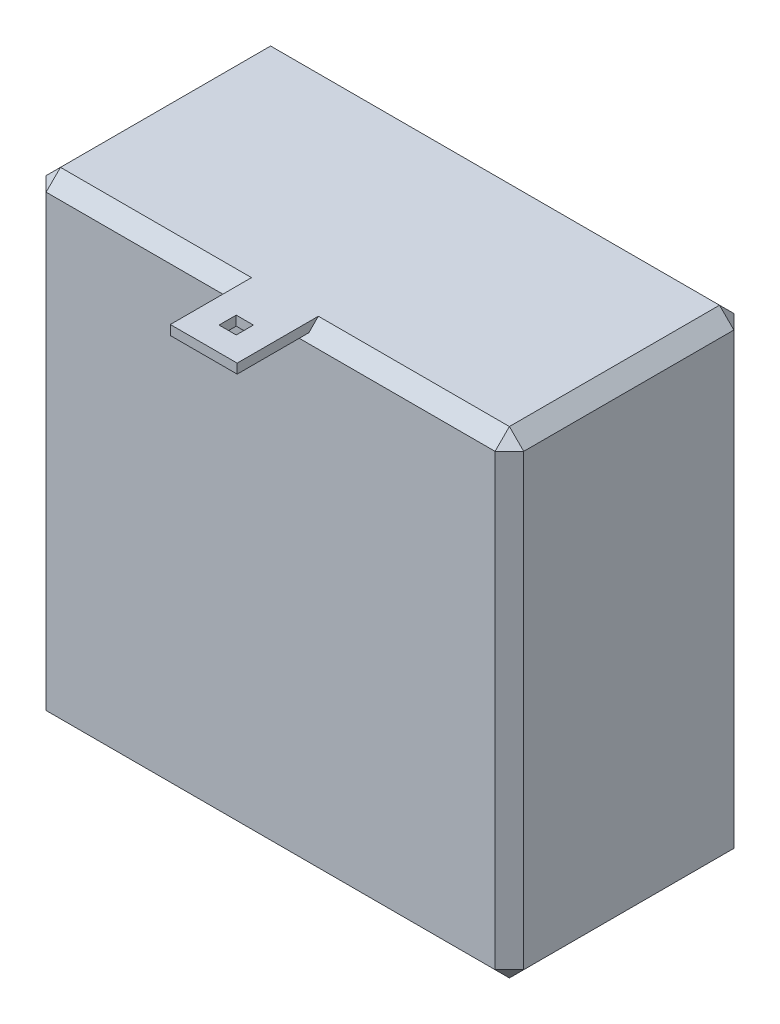
ISO-10303-21;
HEADER;
FILE_DESCRIPTION(('STEP AP214'),'2;1');
FILE_NAME('part.step','',(''),(''),'','','');
FILE_SCHEMA(('AUTOMOTIVE_DESIGN { 1 0 10303 214 1 1 1 1 }'));
ENDSEC;
DATA;
#1=APPLICATION_CONTEXT('core data for automotive mechanical design processes');
#2=APPLICATION_PROTOCOL_DEFINITION('international standard','automotive_design',2000,#1);
#3=PRODUCT_CONTEXT('',#1,'mechanical');
#4=PRODUCT('Part','Part','',(#3));
#5=PRODUCT_RELATED_PRODUCT_CATEGORY('part','',(#4));
#6=PRODUCT_DEFINITION_FORMATION('','',#4);
#7=PRODUCT_DEFINITION_CONTEXT('part definition',#1,'design');
#8=PRODUCT_DEFINITION('design','',#6,#7);
#9=PRODUCT_DEFINITION_SHAPE('','',#8);
#10=(LENGTH_UNIT() NAMED_UNIT(*) SI_UNIT(.MILLI.,.METRE.));
#11=(NAMED_UNIT(*) PLANE_ANGLE_UNIT() SI_UNIT($,.RADIAN.));
#12=(NAMED_UNIT(*) SI_UNIT($,.STERADIAN.) SOLID_ANGLE_UNIT());
#13=UNCERTAINTY_MEASURE_WITH_UNIT(LENGTH_MEASURE(1.E-05),#10,'distance_accuracy_value','');
#14=(GEOMETRIC_REPRESENTATION_CONTEXT(3) GLOBAL_UNCERTAINTY_ASSIGNED_CONTEXT((#13)) GLOBAL_UNIT_ASSIGNED_CONTEXT((#10,
#11,#12)) REPRESENTATION_CONTEXT('',''));
#15=CARTESIAN_POINT('',(0.,0.,0.));
#16=DIRECTION('',(0.,0.,1.));
#17=DIRECTION('',(1.,0.,0.));
#18=AXIS2_PLACEMENT_3D('',#15,#16,#17);
#19=CARTESIAN_POINT('',(0.,0.,25.));
#20=DIRECTION('',(1.,0.,0.));
#21=DIRECTION('',(0.,0.,-1.));
#22=AXIS2_PLACEMENT_3D('',#19,#20,#21);
#23=PLANE('',#22);
#24=DIRECTION('',(0.,0.,-1.));
#25=VECTOR('',#24,1.);
#26=CARTESIAN_POINT('',(0.,48.5,25.));
#27=LINE('',#26,#25);
#28=CARTESIAN_POINT('',(0.,48.5,23.5));
#29=VERTEX_POINT('',#28);
#30=CARTESIAN_POINT('',(0.,48.5,1.49999999999999));
#31=VERTEX_POINT('',#30);
#32=EDGE_CURVE('E233',#29,#31,#27,.T.);
#33=ORIENTED_EDGE('',*,*,#32,.T.);
#34=DIRECTION('',(0.,-1.,0.));
#35=VECTOR('',#34,1.);
#36=CARTESIAN_POINT('',(0.,0.,1.49999999999999));
#37=LINE('',#36,#35);
#38=CARTESIAN_POINT('',(0.,1.49999999999999,1.49999999999999));
#39=VERTEX_POINT('',#38);
#40=EDGE_CURVE('E235',#31,#39,#37,.T.);
#41=ORIENTED_EDGE('',*,*,#40,.T.);
#42=DIRECTION('',(0.,0.,1.));
#43=VECTOR('',#42,1.);
#44=CARTESIAN_POINT('',(0.,1.49999999999999,25.));
#45=LINE('',#44,#43);
#46=CARTESIAN_POINT('',(0.,1.49999999999999,23.5));
#47=VERTEX_POINT('',#46);
#48=EDGE_CURVE('E230',#39,#47,#45,.T.);
#49=ORIENTED_EDGE('',*,*,#48,.T.);
#50=DIRECTION('',(0.,1.,0.));
#51=VECTOR('',#50,1.);
#52=CARTESIAN_POINT('',(0.,0.,23.5));
#53=LINE('',#52,#51);
#54=EDGE_CURVE('E228',#47,#29,#53,.T.);
#55=ORIENTED_EDGE('',*,*,#54,.T.);
#56=EDGE_LOOP('',(#33,#41,#49,#55));
#57=FACE_BOUND('',#56,.T.);
#58=ADVANCED_FACE('F33',(#57),#23,.F.);
#59=CARTESIAN_POINT('',(0.,0.,25.));
#60=DIRECTION('',(0.,1.,0.));
#61=DIRECTION('',(0.,0.,1.));
#62=AXIS2_PLACEMENT_3D('',#59,#60,#61);
#63=PLANE('',#62);
#64=DIRECTION('',(-1.,0.,0.));
#65=VECTOR('',#64,1.);
#66=CARTESIAN_POINT('',(0.,0.,23.5));
#67=LINE('',#66,#65);
#68=CARTESIAN_POINT('',(48.5,0.,23.5));
#69=VERTEX_POINT('',#68);
#70=CARTESIAN_POINT('',(1.49999999999999,0.,23.5));
#71=VERTEX_POINT('',#70);
#72=EDGE_CURVE('E267',#69,#71,#67,.T.);
#73=ORIENTED_EDGE('',*,*,#72,.T.);
#74=DIRECTION('',(0.,0.,-1.));
#75=VECTOR('',#74,1.);
#76=CARTESIAN_POINT('',(1.49999999999999,0.,25.));
#77=LINE('',#76,#75);
#78=CARTESIAN_POINT('',(1.49999999999999,0.,1.49999999999999));
#79=VERTEX_POINT('',#78);
#80=EDGE_CURVE('E273',#71,#79,#77,.T.);
#81=ORIENTED_EDGE('',*,*,#80,.T.);
#82=DIRECTION('',(1.,0.,0.));
#83=VECTOR('',#82,1.);
#84=CARTESIAN_POINT('',(50.,0.,1.49999999999999));
#85=LINE('',#84,#83);
#86=CARTESIAN_POINT('',(48.5,0.,1.49999999999999));
#87=VERTEX_POINT('',#86);
#88=EDGE_CURVE('E271',#79,#87,#85,.T.);
#89=ORIENTED_EDGE('',*,*,#88,.T.);
#90=DIRECTION('',(0.,0.,1.));
#91=VECTOR('',#90,1.);
#92=CARTESIAN_POINT('',(48.5,0.,25.));
#93=LINE('',#92,#91);
#94=EDGE_CURVE('E269',#87,#69,#93,.T.);
#95=ORIENTED_EDGE('',*,*,#94,.T.);
#96=EDGE_LOOP('',(#73,#81,#89,#95));
#97=FACE_BOUND('',#96,.T.);
#98=ADVANCED_FACE('F459',(#97),#63,.F.);
#99=CARTESIAN_POINT('',(50.,0.,25.));
#100=DIRECTION('',(-1.,0.,0.));
#101=DIRECTION('',(0.,0.,1.));
#102=AXIS2_PLACEMENT_3D('',#99,#100,#101);
#103=PLANE('',#102);
#104=DIRECTION('',(0.,1.,0.));
#105=VECTOR('',#104,1.);
#106=CARTESIAN_POINT('',(50.,50.,1.49999999999999));
#107=LINE('',#106,#105);
#108=CARTESIAN_POINT('',(50.,1.49999999999999,1.49999999999999));
#109=VERTEX_POINT('',#108);
#110=CARTESIAN_POINT('',(50.,48.5,1.49999999999999));
#111=VERTEX_POINT('',#110);
#112=EDGE_CURVE('E262',#109,#111,#107,.T.);
#113=ORIENTED_EDGE('',*,*,#112,.T.);
#114=DIRECTION('',(0.,0.,1.));
#115=VECTOR('',#114,1.);
#116=CARTESIAN_POINT('',(50.,48.5,25.));
#117=LINE('',#116,#115);
#118=CARTESIAN_POINT('',(50.,48.5,23.5));
#119=VERTEX_POINT('',#118);
#120=EDGE_CURVE('E264',#111,#119,#117,.T.);
#121=ORIENTED_EDGE('',*,*,#120,.T.);
#122=DIRECTION('',(0.,-1.,0.));
#123=VECTOR('',#122,1.);
#124=CARTESIAN_POINT('',(50.,0.,23.5));
#125=LINE('',#124,#123);
#126=CARTESIAN_POINT('',(50.,1.49999999999999,23.5));
#127=VERTEX_POINT('',#126);
#128=EDGE_CURVE('E258',#119,#127,#125,.T.);
#129=ORIENTED_EDGE('',*,*,#128,.T.);
#130=DIRECTION('',(0.,0.,-1.));
#131=VECTOR('',#130,1.);
#132=CARTESIAN_POINT('',(50.,1.49999999999999,25.));
#133=LINE('',#132,#131);
#134=EDGE_CURVE('E260',#127,#109,#133,.T.);
#135=ORIENTED_EDGE('',*,*,#134,.T.);
#136=EDGE_LOOP('',(#113,#121,#129,#135));
#137=FACE_BOUND('',#136,.T.);
#138=ADVANCED_FACE('F457',(#137),#103,.F.);
#139=CARTESIAN_POINT('',(0.,50.,25.));
#140=DIRECTION('',(0.,-1.,0.));
#141=DIRECTION('',(0.,0.,-1.));
#142=AXIS2_PLACEMENT_3D('',#139,#140,#141);
#143=PLANE('',#142);
#144=DIRECTION('',(-1.,0.,0.));
#145=VECTOR('',#144,1.);
#146=CARTESIAN_POINT('',(0.,50.,29.5));
#147=LINE('',#146,#145);
#148=CARTESIAN_POINT('',(25.9,50.,29.5));
#149=VERTEX_POINT('',#148);
#150=CARTESIAN_POINT('',(24.1,50.,29.5));
#151=VERTEX_POINT('',#150);
#152=EDGE_CURVE('E201',#149,#151,#147,.T.);
#153=ORIENTED_EDGE('',*,*,#152,.T.);
#154=DIRECTION('',(0.,0.,-1.));
#155=VECTOR('',#154,1.);
#156=CARTESIAN_POINT('',(24.1,50.,25.));
#157=LINE('',#156,#155);
#158=CARTESIAN_POINT('',(24.1,50.,27.7));
#159=VERTEX_POINT('',#158);
#160=EDGE_CURVE('E204',#151,#159,#157,.T.);
#161=ORIENTED_EDGE('',*,*,#160,.T.);
#162=DIRECTION('',(1.,0.,0.));
#163=VECTOR('',#162,1.);
#164=CARTESIAN_POINT('',(0.,50.,27.7));
#165=LINE('',#164,#163);
#166=CARTESIAN_POINT('',(25.9,50.,27.7));
#167=VERTEX_POINT('',#166);
#168=EDGE_CURVE('E196',#159,#167,#165,.T.);
#169=ORIENTED_EDGE('',*,*,#168,.T.);
#170=DIRECTION('',(0.,0.,1.));
#171=VECTOR('',#170,1.);
#172=CARTESIAN_POINT('',(25.9,50.,25.));
#173=LINE('',#172,#171);
#174=EDGE_CURVE('E176',#167,#149,#173,.T.);
#175=ORIENTED_EDGE('',*,*,#174,.T.);
#176=EDGE_LOOP('',(#153,#161,#169,#175));
#177=FACE_BOUND('',#176,.T.);
#178=DIRECTION('',(0.,0.,1.));
#179=VECTOR('',#178,1.);
#180=CARTESIAN_POINT('',(28.5,50.,15.));
#181=LINE('',#180,#179);
#182=CARTESIAN_POINT('',(28.5,50.,23.5));
#183=VERTEX_POINT('',#182);
#184=CARTESIAN_POINT('',(28.5,50.,32.));
#185=VERTEX_POINT('',#184);
#186=EDGE_CURVE('E223',#183,#185,#181,.T.);
#187=ORIENTED_EDGE('',*,*,#186,.F.);
#188=DIRECTION('',(1.,0.,0.));
#189=VECTOR('',#188,1.);
#190=CARTESIAN_POINT('',(0.,50.,23.5));
#191=LINE('',#190,#189);
#192=CARTESIAN_POINT('',(48.5,50.,23.5));
#193=VERTEX_POINT('',#192);
#194=EDGE_CURVE('E247',#183,#193,#191,.T.);
#195=ORIENTED_EDGE('',*,*,#194,.T.);
#196=DIRECTION('',(0.,0.,-1.));
#197=VECTOR('',#196,1.);
#198=CARTESIAN_POINT('',(48.5,50.,25.));
#199=LINE('',#198,#197);
#200=CARTESIAN_POINT('',(48.5,50.,1.49999999999999));
#201=VERTEX_POINT('',#200);
#202=EDGE_CURVE('E251',#193,#201,#199,.T.);
#203=ORIENTED_EDGE('',*,*,#202,.T.);
#204=DIRECTION('',(-1.,0.,0.));
#205=VECTOR('',#204,1.);
#206=CARTESIAN_POINT('',(0.,50.,1.49999999999999));
#207=LINE('',#206,#205);
#208=CARTESIAN_POINT('',(1.49999999999999,50.,1.49999999999999));
#209=VERTEX_POINT('',#208);
#210=EDGE_CURVE('E253',#201,#209,#207,.T.);
#211=ORIENTED_EDGE('',*,*,#210,.T.);
#212=DIRECTION('',(0.,0.,1.));
#213=VECTOR('',#212,1.);
#214=CARTESIAN_POINT('',(1.49999999999999,50.,25.));
#215=LINE('',#214,#213);
#216=CARTESIAN_POINT('',(1.49999999999999,50.,23.5));
#217=VERTEX_POINT('',#216);
#218=EDGE_CURVE('E255',#209,#217,#215,.T.);
#219=ORIENTED_EDGE('',*,*,#218,.T.);
#220=CARTESIAN_POINT('',(21.5,50.,23.5));
#221=VERTEX_POINT('',#220);
#222=EDGE_CURVE('E248',#217,#221,#191,.T.);
#223=ORIENTED_EDGE('',*,*,#222,.T.);
#224=DIRECTION('',(0.,0.,1.));
#225=VECTOR('',#224,1.);
#226=CARTESIAN_POINT('',(21.5,50.,15.));
#227=LINE('',#226,#225);
#228=CARTESIAN_POINT('',(21.5,50.,32.));
#229=VERTEX_POINT('',#228);
#230=EDGE_CURVE('E220',#221,#229,#227,.T.);
#231=ORIENTED_EDGE('',*,*,#230,.T.);
#232=DIRECTION('',(-1.,0.,0.));
#233=VECTOR('',#232,1.);
#234=CARTESIAN_POINT('',(21.5,50.,32.));
#235=LINE('',#234,#233);
#236=EDGE_CURVE('E216',#185,#229,#235,.T.);
#237=ORIENTED_EDGE('',*,*,#236,.F.);
#238=EDGE_LOOP('',(#187,#195,#203,#211,#219,#223,#231,#237));
#239=FACE_BOUND('',#238,.T.);
#240=ADVANCED_FACE('F360',(#177,#239),#143,.F.);
#241=CARTESIAN_POINT('',(0.,0.,25.));
#242=DIRECTION('',(0.,0.,-1.));
#243=DIRECTION('',(-1.,0.,0.));
#244=AXIS2_PLACEMENT_3D('',#241,#242,#243);
#245=PLANE('',#244);
#246=DIRECTION('',(0.,1.,0.));
#247=VECTOR('',#246,1.);
#248=CARTESIAN_POINT('',(48.5,0.,25.));
#249=LINE('',#248,#247);
#250=CARTESIAN_POINT('',(48.5,1.49999999999999,25.));
#251=VERTEX_POINT('',#250);
#252=CARTESIAN_POINT('',(48.5,48.5,25.));
#253=VERTEX_POINT('',#252);
#254=EDGE_CURVE('E280',#251,#253,#249,.T.);
#255=ORIENTED_EDGE('',*,*,#254,.T.);
#256=DIRECTION('',(-1.,0.,0.));
#257=VECTOR('',#256,1.);
#258=CARTESIAN_POINT('',(0.,48.5,25.));
#259=LINE('',#258,#257);
#260=CARTESIAN_POINT('',(1.49999999999999,48.5,25.));
#261=VERTEX_POINT('',#260);
#262=EDGE_CURVE('E282',#253,#261,#259,.T.);
#263=ORIENTED_EDGE('',*,*,#262,.T.);
#264=DIRECTION('',(0.,-1.,0.));
#265=VECTOR('',#264,1.);
#266=CARTESIAN_POINT('',(1.49999999999999,0.,25.));
#267=LINE('',#266,#265);
#268=CARTESIAN_POINT('',(1.49999999999999,1.49999999999999,25.));
#269=VERTEX_POINT('',#268);
#270=EDGE_CURVE('E276',#261,#269,#267,.T.);
#271=ORIENTED_EDGE('',*,*,#270,.T.);
#272=DIRECTION('',(1.,0.,0.));
#273=VECTOR('',#272,1.);
#274=CARTESIAN_POINT('',(0.,1.49999999999999,25.));
#275=LINE('',#274,#273);
#276=EDGE_CURVE('E278',#269,#251,#275,.T.);
#277=ORIENTED_EDGE('',*,*,#276,.T.);
#278=EDGE_LOOP('',(#255,#263,#271,#277));
#279=FACE_BOUND('',#278,.T.);
#280=ADVANCED_FACE('F405',(#279),#245,.F.);
#281=CARTESIAN_POINT('',(0.,0.,0.));
#282=DIRECTION('',(0.,0.,-1.));
#283=DIRECTION('',(-1.,0.,0.));
#284=AXIS2_PLACEMENT_3D('',#281,#282,#283);
#285=PLANE('',#284);
#286=DIRECTION('',(-1.,0.,0.));
#287=VECTOR('',#286,1.);
#288=CARTESIAN_POINT('',(0.,1.49999999999999,0.));
#289=LINE('',#288,#287);
#290=CARTESIAN_POINT('',(48.5,1.49999999999999,0.));
#291=VERTEX_POINT('',#290);
#292=CARTESIAN_POINT('',(1.49999999999999,1.49999999999999,0.));
#293=VERTEX_POINT('',#292);
#294=EDGE_CURVE('E238',#291,#293,#289,.T.);
#295=ORIENTED_EDGE('',*,*,#294,.T.);
#296=DIRECTION('',(0.,1.,0.));
#297=VECTOR('',#296,1.);
#298=CARTESIAN_POINT('',(1.49999999999999,50.,0.));
#299=LINE('',#298,#297);
#300=CARTESIAN_POINT('',(1.49999999999999,48.5,0.));
#301=VERTEX_POINT('',#300);
#302=EDGE_CURVE('E244',#293,#301,#299,.T.);
#303=ORIENTED_EDGE('',*,*,#302,.T.);
#304=DIRECTION('',(1.,0.,0.));
#305=VECTOR('',#304,1.);
#306=CARTESIAN_POINT('',(50.,48.5,0.));
#307=LINE('',#306,#305);
#308=CARTESIAN_POINT('',(48.5,48.5,0.));
#309=VERTEX_POINT('',#308);
#310=EDGE_CURVE('E242',#301,#309,#307,.T.);
#311=ORIENTED_EDGE('',*,*,#310,.T.);
#312=DIRECTION('',(0.,-1.,0.));
#313=VECTOR('',#312,1.);
#314=CARTESIAN_POINT('',(48.5,0.,0.));
#315=LINE('',#314,#313);
#316=EDGE_CURVE('E240',#309,#291,#315,.T.);
#317=ORIENTED_EDGE('',*,*,#316,.T.);
#318=EDGE_LOOP('',(#295,#303,#311,#317));
#319=FACE_BOUND('',#318,.T.);
#320=ADVANCED_FACE('F431',(#319),#285,.T.);
#321=CARTESIAN_POINT('',(48.5,0.,25.));
#322=DIRECTION('',(-0.707106781186549,0.,-0.707106781186546));
#323=DIRECTION('',(0.,1.,0.));
#324=AXIS2_PLACEMENT_3D('',#321,#322,#323);
#325=PLANE('',#324);
#326=DIRECTION('',(-0.707106781186546,0.,0.707106781186549));
#327=VECTOR('',#326,1.);
#328=CARTESIAN_POINT('',(50.,48.5,23.5));
#329=LINE('',#328,#327);
#330=EDGE_CURVE('E231',#253,#119,#329,.F.);
#331=ORIENTED_EDGE('',*,*,#330,.F.);
#332=ORIENTED_EDGE('',*,*,#254,.F.);
#333=DIRECTION('',(0.707106781186546,0.,-0.707106781186549));
#334=VECTOR('',#333,1.);
#335=CARTESIAN_POINT('',(49.25,1.49999999999999,24.25));
#336=LINE('',#335,#334);
#337=EDGE_CURVE('E345',#127,#251,#336,.F.);
#338=ORIENTED_EDGE('',*,*,#337,.F.);
#339=ORIENTED_EDGE('',*,*,#128,.F.);
#340=EDGE_LOOP('',(#331,#332,#338,#339));
#341=FACE_BOUND('',#340,.T.);
#342=ADVANCED_FACE('F35',(#341),#325,.F.);
#343=CARTESIAN_POINT('',(50.,48.5,23.5));
#344=DIRECTION('',(0.577350269189628,0.577350269189626,0.577350269189623));
#345=DIRECTION('',(-0.707106781186546,0.707106781186549,0.));
#346=AXIS2_PLACEMENT_3D('',#343,#344,#345);
#347=PLANE('',#346);
#348=DIRECTION('',(0.,0.707106781186546,-0.707106781186549));
#349=VECTOR('',#348,1.);
#350=CARTESIAN_POINT('',(48.5,49.25,24.25));
#351=LINE('',#350,#349);
#352=EDGE_CURVE('E340',#253,#193,#351,.T.);
#353=ORIENTED_EDGE('',*,*,#352,.F.);
#354=ORIENTED_EDGE('',*,*,#330,.T.);
#355=DIRECTION('',(0.707106781186546,-0.707106781186549,0.));
#356=VECTOR('',#355,1.);
#357=CARTESIAN_POINT('',(50.,48.5,23.5));
#358=LINE('',#357,#356);
#359=EDGE_CURVE('E343',#193,#119,#358,.T.);
#360=ORIENTED_EDGE('',*,*,#359,.F.);
#361=EDGE_LOOP('',(#353,#354,#360));
#362=FACE_BOUND('',#361,.T.);
#363=ADVANCED_FACE('F413',(#362),#347,.T.);
#364=CARTESIAN_POINT('',(48.5,0.,23.5));
#365=DIRECTION('',(0.577350269189626,-0.577350269189628,0.577350269189623));
#366=DIRECTION('',(0.707106781186549,0.707106781186546,0.));
#367=AXIS2_PLACEMENT_3D('',#364,#365,#366);
#368=PLANE('',#367);
#369=DIRECTION('',(-0.707106781186549,-0.707106781186546,0.));
#370=VECTOR('',#369,1.);
#371=CARTESIAN_POINT('',(48.5,0.,23.5));
#372=LINE('',#371,#370);
#373=EDGE_CURVE('E334',#127,#69,#372,.T.);
#374=ORIENTED_EDGE('',*,*,#373,.F.);
#375=ORIENTED_EDGE('',*,*,#337,.T.);
#376=DIRECTION('',(0.,0.707106781186546,0.707106781186549));
#377=VECTOR('',#376,1.);
#378=CARTESIAN_POINT('',(48.5,0.,23.5));
#379=LINE('',#378,#377);
#380=EDGE_CURVE('E337',#69,#251,#379,.T.);
#381=ORIENTED_EDGE('',*,*,#380,.F.);
#382=EDGE_LOOP('',(#374,#375,#381));
#383=FACE_BOUND('',#382,.T.);
#384=ADVANCED_FACE('F451',(#383),#368,.T.);
#385=CARTESIAN_POINT('',(48.5,50.,25.));
#386=DIRECTION('',(-0.707106781186549,-0.707106781186546,0.));
#387=DIRECTION('',(0.,0.,-1.));
#388=AXIS2_PLACEMENT_3D('',#385,#386,#387);
#389=PLANE('',#388);
#390=ORIENTED_EDGE('',*,*,#359,.T.);
#391=ORIENTED_EDGE('',*,*,#120,.F.);
#392=DIRECTION('',(-0.707106781186546,0.707106781186549,0.));
#393=VECTOR('',#392,1.);
#394=CARTESIAN_POINT('',(49.25,49.25,1.49999999999999));
#395=LINE('',#394,#393);
#396=EDGE_CURVE('E328',#201,#111,#395,.F.);
#397=ORIENTED_EDGE('',*,*,#396,.F.);
#398=ORIENTED_EDGE('',*,*,#202,.F.);
#399=EDGE_LOOP('',(#390,#391,#397,#398));
#400=FACE_BOUND('',#399,.T.);
#401=ADVANCED_FACE('F418',(#400),#389,.F.);
#402=CARTESIAN_POINT('',(0.,48.5,25.));
#403=DIRECTION('',(0.,-0.707106781186549,-0.707106781186546));
#404=DIRECTION('',(-1.,0.,0.));
#405=AXIS2_PLACEMENT_3D('',#402,#403,#404);
#406=PLANE('',#405);
#407=DIRECTION('',(0.,0.707106781186546,-0.707106781186549));
#408=VECTOR('',#407,1.);
#409=CARTESIAN_POINT('',(21.5,48.5,25.));
#410=LINE('',#409,#408);
#411=CARTESIAN_POINT('',(21.5,49.,24.5));
#412=VERTEX_POINT('',#411);
#413=EDGE_CURVE('E11',#221,#412,#410,.F.);
#414=ORIENTED_EDGE('',*,*,#413,.F.);
#415=ORIENTED_EDGE('',*,*,#222,.F.);
#416=DIRECTION('',(0.,-0.707106781186546,0.707106781186549));
#417=VECTOR('',#416,1.);
#418=CARTESIAN_POINT('',(1.49999999999999,50.,23.5));
#419=LINE('',#418,#417);
#420=EDGE_CURVE('E325',#261,#217,#419,.F.);
#421=ORIENTED_EDGE('',*,*,#420,.F.);
#422=ORIENTED_EDGE('',*,*,#262,.F.);
#423=ORIENTED_EDGE('',*,*,#352,.T.);
#424=ORIENTED_EDGE('',*,*,#194,.F.);
#425=DIRECTION('',(0.,-0.707106781186546,0.707106781186549));
#426=VECTOR('',#425,1.);
#427=CARTESIAN_POINT('',(28.5,48.5,25.));
#428=LINE('',#427,#426);
#429=CARTESIAN_POINT('',(28.5,49.,24.5));
#430=VERTEX_POINT('',#429);
#431=EDGE_CURVE('E41',#430,#183,#428,.F.);
#432=ORIENTED_EDGE('',*,*,#431,.F.);
#433=DIRECTION('',(-1.,0.,0.));
#434=VECTOR('',#433,1.);
#435=CARTESIAN_POINT('',(0.,49.,24.5));
#436=LINE('',#435,#434);
#437=EDGE_CURVE('E285',#412,#430,#436,.F.);
#438=ORIENTED_EDGE('',*,*,#437,.F.);
#439=EDGE_LOOP('',(#414,#415,#421,#422,#423,#424,#432,#438));
#440=FACE_BOUND('',#439,.T.);
#441=ADVANCED_FACE('F369',(#440),#406,.F.);
#442=CARTESIAN_POINT('',(1.49999999999999,0.,25.));
#443=DIRECTION('',(0.707106781186549,0.,-0.707106781186546));
#444=DIRECTION('',(0.,-1.,0.));
#445=AXIS2_PLACEMENT_3D('',#442,#443,#444);
#446=PLANE('',#445);
#447=DIRECTION('',(0.707106781186546,0.,0.707106781186549));
#448=VECTOR('',#447,1.);
#449=CARTESIAN_POINT('',(0.,1.49999999999999,23.5));
#450=LINE('',#449,#448);
#451=EDGE_CURVE('E320',#269,#47,#450,.F.);
#452=ORIENTED_EDGE('',*,*,#451,.F.);
#453=ORIENTED_EDGE('',*,*,#270,.F.);
#454=DIRECTION('',(-0.707106781186546,0.,-0.707106781186549));
#455=VECTOR('',#454,1.);
#456=CARTESIAN_POINT('',(0.749999999999994,48.5,24.25));
#457=LINE('',#456,#455);
#458=EDGE_CURVE('E323',#29,#261,#457,.F.);
#459=ORIENTED_EDGE('',*,*,#458,.F.);
#460=ORIENTED_EDGE('',*,*,#54,.F.);
#461=EDGE_LOOP('',(#452,#453,#459,#460));
#462=FACE_BOUND('',#461,.T.);
#463=ADVANCED_FACE('F398',(#462),#446,.F.);
#464=CARTESIAN_POINT('',(0.,1.49999999999999,25.));
#465=DIRECTION('',(0.,0.707106781186549,-0.707106781186546));
#466=DIRECTION('',(1.,0.,0.));
#467=AXIS2_PLACEMENT_3D('',#464,#465,#466);
#468=PLANE('',#467);
#469=ORIENTED_EDGE('',*,*,#380,.T.);
#470=ORIENTED_EDGE('',*,*,#276,.F.);
#471=DIRECTION('',(0.,-0.707106781186546,-0.707106781186549));
#472=VECTOR('',#471,1.);
#473=CARTESIAN_POINT('',(1.49999999999999,0.749999999999994,24.25));
#474=LINE('',#473,#472);
#475=EDGE_CURVE('E317',#71,#269,#474,.F.);
#476=ORIENTED_EDGE('',*,*,#475,.F.);
#477=ORIENTED_EDGE('',*,*,#72,.F.);
#478=EDGE_LOOP('',(#469,#470,#476,#477));
#479=FACE_BOUND('',#478,.T.);
#480=ADVANCED_FACE('F447',(#479),#468,.F.);
#481=CARTESIAN_POINT('',(50.,1.49999999999999,25.));
#482=DIRECTION('',(-0.707106781186546,0.707106781186549,0.));
#483=DIRECTION('',(0.,0.,-1.));
#484=AXIS2_PLACEMENT_3D('',#481,#482,#483);
#485=PLANE('',#484);
#486=ORIENTED_EDGE('',*,*,#373,.T.);
#487=ORIENTED_EDGE('',*,*,#94,.F.);
#488=DIRECTION('',(0.707106781186549,0.707106781186546,0.));
#489=VECTOR('',#488,1.);
#490=CARTESIAN_POINT('',(49.25,0.749999999999994,1.49999999999999));
#491=LINE('',#490,#489);
#492=EDGE_CURVE('E314',#109,#87,#491,.F.);
#493=ORIENTED_EDGE('',*,*,#492,.F.);
#494=ORIENTED_EDGE('',*,*,#134,.F.);
#495=EDGE_LOOP('',(#486,#487,#493,#494));
#496=FACE_BOUND('',#495,.T.);
#497=ADVANCED_FACE('F455',(#496),#485,.F.);
#498=CARTESIAN_POINT('',(50.,0.,1.49999999999999));
#499=DIRECTION('',(0.707106781186546,0.,-0.707106781186549));
#500=DIRECTION('',(0.,-1.,0.));
#501=AXIS2_PLACEMENT_3D('',#498,#499,#500);
#502=PLANE('',#501);
#503=DIRECTION('',(-0.707106781186549,0.,-0.707106781186546));
#504=VECTOR('',#503,1.);
#505=CARTESIAN_POINT('',(48.5,48.5,0.));
#506=LINE('',#505,#504);
#507=EDGE_CURVE('E331',#111,#309,#506,.T.);
#508=ORIENTED_EDGE('',*,*,#507,.F.);
#509=ORIENTED_EDGE('',*,*,#112,.F.);
#510=DIRECTION('',(0.707106781186549,0.,0.707106781186546));
#511=VECTOR('',#510,1.);
#512=CARTESIAN_POINT('',(48.5,1.49999999999999,0.));
#513=LINE('',#512,#511);
#514=EDGE_CURVE('E311',#291,#109,#513,.T.);
#515=ORIENTED_EDGE('',*,*,#514,.F.);
#516=ORIENTED_EDGE('',*,*,#316,.F.);
#517=EDGE_LOOP('',(#508,#509,#515,#516));
#518=FACE_BOUND('',#517,.T.);
#519=ADVANCED_FACE('F426',(#518),#502,.T.);
#520=CARTESIAN_POINT('',(48.5,48.5,0.));
#521=DIRECTION('',(0.577350269189626,0.577350269189623,-0.577350269189628));
#522=DIRECTION('',(-0.707106781186549,0.,-0.707106781186546));
#523=AXIS2_PLACEMENT_3D('',#520,#521,#522);
#524=PLANE('',#523);
#525=ORIENTED_EDGE('',*,*,#396,.T.);
#526=ORIENTED_EDGE('',*,*,#507,.T.);
#527=DIRECTION('',(0.,0.707106781186549,0.707106781186546));
#528=VECTOR('',#527,1.);
#529=CARTESIAN_POINT('',(48.5,48.5,0.));
#530=LINE('',#529,#528);
#531=EDGE_CURVE('E308',#201,#309,#530,.F.);
#532=ORIENTED_EDGE('',*,*,#531,.F.);
#533=EDGE_LOOP('',(#525,#526,#532));
#534=FACE_BOUND('',#533,.T.);
#535=ADVANCED_FACE('F422',(#534),#524,.T.);
#536=CARTESIAN_POINT('',(1.49999999999999,50.,23.5));
#537=DIRECTION('',(-0.577350269189628,0.577350269189626,0.577350269189623));
#538=DIRECTION('',(-0.707106781186546,-0.707106781186549,0.));
#539=AXIS2_PLACEMENT_3D('',#536,#537,#538);
#540=PLANE('',#539);
#541=ORIENTED_EDGE('',*,*,#458,.T.);
#542=ORIENTED_EDGE('',*,*,#420,.T.);
#543=DIRECTION('',(0.707106781186546,0.707106781186549,0.));
#544=VECTOR('',#543,1.);
#545=CARTESIAN_POINT('',(1.49999999999999,50.,23.5));
#546=LINE('',#545,#544);
#547=EDGE_CURVE('E306',#29,#217,#546,.T.);
#548=ORIENTED_EDGE('',*,*,#547,.F.);
#549=EDGE_LOOP('',(#541,#542,#548));
#550=FACE_BOUND('',#549,.T.);
#551=ADVANCED_FACE('F400',(#550),#540,.T.);
#552=CARTESIAN_POINT('',(0.,1.49999999999999,23.5));
#553=DIRECTION('',(-0.577350269189628,-0.577350269189626,0.577350269189623));
#554=DIRECTION('',(0.707106781186546,-0.707106781186549,0.));
#555=AXIS2_PLACEMENT_3D('',#552,#553,#554);
#556=PLANE('',#555);
#557=ORIENTED_EDGE('',*,*,#475,.T.);
#558=ORIENTED_EDGE('',*,*,#451,.T.);
#559=DIRECTION('',(-0.707106781186546,0.707106781186549,0.));
#560=VECTOR('',#559,1.);
#561=CARTESIAN_POINT('',(0.,1.49999999999999,23.5));
#562=LINE('',#561,#560);
#563=EDGE_CURVE('E303',#71,#47,#562,.T.);
#564=ORIENTED_EDGE('',*,*,#563,.F.);
#565=EDGE_LOOP('',(#557,#558,#564));
#566=FACE_BOUND('',#565,.T.);
#567=ADVANCED_FACE('F443',(#566),#556,.T.);
#568=CARTESIAN_POINT('',(48.5,1.49999999999999,0.));
#569=DIRECTION('',(0.577350269189623,-0.577350269189626,-0.577350269189628));
#570=DIRECTION('',(0.,0.707106781186549,-0.707106781186546));
#571=AXIS2_PLACEMENT_3D('',#568,#569,#570);
#572=PLANE('',#571);
#573=ORIENTED_EDGE('',*,*,#514,.T.);
#574=ORIENTED_EDGE('',*,*,#492,.T.);
#575=DIRECTION('',(0.,0.707106781186549,-0.707106781186546));
#576=VECTOR('',#575,1.);
#577=CARTESIAN_POINT('',(48.5,1.49999999999999,0.));
#578=LINE('',#577,#576);
#579=EDGE_CURVE('E300',#291,#87,#578,.F.);
#580=ORIENTED_EDGE('',*,*,#579,.F.);
#581=EDGE_LOOP('',(#573,#574,#580));
#582=FACE_BOUND('',#581,.T.);
#583=ADVANCED_FACE('F490',(#582),#572,.T.);
#584=CARTESIAN_POINT('',(0.,50.,1.49999999999999));
#585=DIRECTION('',(0.,0.707106781186546,-0.707106781186549));
#586=DIRECTION('',(1.,0.,0.));
#587=AXIS2_PLACEMENT_3D('',#584,#585,#586);
#588=PLANE('',#587);
#589=ORIENTED_EDGE('',*,*,#531,.T.);
#590=ORIENTED_EDGE('',*,*,#310,.F.);
#591=DIRECTION('',(0.,-0.707106781186549,-0.707106781186546));
#592=VECTOR('',#591,1.);
#593=CARTESIAN_POINT('',(1.49999999999999,48.5,0.));
#594=LINE('',#593,#592);
#595=EDGE_CURVE('E297',#209,#301,#594,.T.);
#596=ORIENTED_EDGE('',*,*,#595,.F.);
#597=ORIENTED_EDGE('',*,*,#210,.F.);
#598=EDGE_LOOP('',(#589,#590,#596,#597));
#599=FACE_BOUND('',#598,.T.);
#600=ADVANCED_FACE('F383',(#599),#588,.T.);
#601=CARTESIAN_POINT('',(0.,48.5,25.));
#602=DIRECTION('',(0.707106781186549,-0.707106781186546,0.));
#603=DIRECTION('',(0.,0.,-1.));
#604=AXIS2_PLACEMENT_3D('',#601,#602,#603);
#605=PLANE('',#604);
#606=ORIENTED_EDGE('',*,*,#547,.T.);
#607=ORIENTED_EDGE('',*,*,#218,.F.);
#608=DIRECTION('',(-0.707106781186546,-0.707106781186549,0.));
#609=VECTOR('',#608,1.);
#610=CARTESIAN_POINT('',(0.749999999999994,49.25,1.49999999999999));
#611=LINE('',#610,#609);
#612=EDGE_CURVE('E294',#31,#209,#611,.F.);
#613=ORIENTED_EDGE('',*,*,#612,.F.);
#614=ORIENTED_EDGE('',*,*,#32,.F.);
#615=EDGE_LOOP('',(#606,#607,#613,#614));
#616=FACE_BOUND('',#615,.T.);
#617=ADVANCED_FACE('F377',(#616),#605,.F.);
#618=CARTESIAN_POINT('',(1.49999999999999,0.,25.));
#619=DIRECTION('',(0.707106781186549,0.707106781186546,0.));
#620=DIRECTION('',(0.,0.,-1.));
#621=AXIS2_PLACEMENT_3D('',#618,#619,#620);
#622=PLANE('',#621);
#623=ORIENTED_EDGE('',*,*,#563,.T.);
#624=ORIENTED_EDGE('',*,*,#48,.F.);
#625=DIRECTION('',(0.707106781186546,-0.707106781186549,0.));
#626=VECTOR('',#625,1.);
#627=CARTESIAN_POINT('',(0.,1.49999999999999,1.49999999999999));
#628=LINE('',#627,#626);
#629=EDGE_CURVE('E291',#79,#39,#628,.F.);
#630=ORIENTED_EDGE('',*,*,#629,.F.);
#631=ORIENTED_EDGE('',*,*,#80,.F.);
#632=EDGE_LOOP('',(#623,#624,#630,#631));
#633=FACE_BOUND('',#632,.T.);
#634=ADVANCED_FACE('F440',(#633),#622,.F.);
#635=CARTESIAN_POINT('',(0.,0.,1.49999999999999));
#636=DIRECTION('',(0.,-0.707106781186546,-0.707106781186549));
#637=DIRECTION('',(-1.,0.,0.));
#638=AXIS2_PLACEMENT_3D('',#635,#636,#637);
#639=PLANE('',#638);
#640=ORIENTED_EDGE('',*,*,#579,.T.);
#641=ORIENTED_EDGE('',*,*,#88,.F.);
#642=DIRECTION('',(0.,-0.707106781186549,0.707106781186546));
#643=VECTOR('',#642,1.);
#644=CARTESIAN_POINT('',(1.49999999999999,0.749999999999997,0.749999999999994));
#645=LINE('',#644,#643);
#646=EDGE_CURVE('E289',#293,#79,#645,.T.);
#647=ORIENTED_EDGE('',*,*,#646,.F.);
#648=ORIENTED_EDGE('',*,*,#294,.F.);
#649=EDGE_LOOP('',(#640,#641,#647,#648));
#650=FACE_BOUND('',#649,.T.);
#651=ADVANCED_FACE('F480',(#650),#639,.T.);
#652=CARTESIAN_POINT('',(1.49999999999999,48.5,0.));
#653=DIRECTION('',(-0.577350269189628,0.577350269189623,-0.577350269189626));
#654=DIRECTION('',(-0.707106781186546,0.,0.707106781186549));
#655=AXIS2_PLACEMENT_3D('',#652,#653,#654);
#656=PLANE('',#655);
#657=ORIENTED_EDGE('',*,*,#612,.T.);
#658=ORIENTED_EDGE('',*,*,#595,.T.);
#659=DIRECTION('',(-0.707106781186546,0.,0.707106781186549));
#660=VECTOR('',#659,1.);
#661=CARTESIAN_POINT('',(1.49999999999999,48.5,0.));
#662=LINE('',#661,#660);
#663=EDGE_CURVE('E287',#31,#301,#662,.F.);
#664=ORIENTED_EDGE('',*,*,#663,.F.);
#665=EDGE_LOOP('',(#657,#658,#664));
#666=FACE_BOUND('',#665,.T.);
#667=ADVANCED_FACE('F385',(#666),#656,.T.);
#668=CARTESIAN_POINT('',(0.,1.49999999999999,1.49999999999999));
#669=DIRECTION('',(-0.577350269189628,-0.577350269189623,-0.577350269189626));
#670=DIRECTION('',(-0.707106781186546,0.,0.707106781186549));
#671=AXIS2_PLACEMENT_3D('',#668,#669,#670);
#672=PLANE('',#671);
#673=ORIENTED_EDGE('',*,*,#646,.T.);
#674=ORIENTED_EDGE('',*,*,#629,.T.);
#675=DIRECTION('',(0.707106781186546,0.,-0.707106781186549));
#676=VECTOR('',#675,1.);
#677=CARTESIAN_POINT('',(0.,1.49999999999999,1.49999999999999));
#678=LINE('',#677,#676);
#679=EDGE_CURVE('E222',#293,#39,#678,.F.);
#680=ORIENTED_EDGE('',*,*,#679,.F.);
#681=EDGE_LOOP('',(#673,#674,#680));
#682=FACE_BOUND('',#681,.T.);
#683=ADVANCED_FACE('F435',(#682),#672,.T.);
#684=CARTESIAN_POINT('',(0.,0.,1.49999999999999));
#685=DIRECTION('',(-0.707106781186549,0.,-0.707106781186546));
#686=DIRECTION('',(0.,1.,0.));
#687=AXIS2_PLACEMENT_3D('',#684,#685,#686);
#688=PLANE('',#687);
#689=ORIENTED_EDGE('',*,*,#663,.T.);
#690=ORIENTED_EDGE('',*,*,#302,.F.);
#691=ORIENTED_EDGE('',*,*,#679,.T.);
#692=ORIENTED_EDGE('',*,*,#40,.F.);
#693=EDGE_LOOP('',(#689,#690,#691,#692));
#694=FACE_BOUND('',#693,.T.);
#695=ADVANCED_FACE('F389',(#694),#688,.T.);
#696=CARTESIAN_POINT('',(21.5,50.,15.));
#697=DIRECTION('',(-1.,0.,0.));
#698=DIRECTION('',(0.,0.,1.));
#699=AXIS2_PLACEMENT_3D('',#696,#697,#698);
#700=PLANE('',#699);
#701=ORIENTED_EDGE('',*,*,#230,.F.);
#702=ORIENTED_EDGE('',*,*,#413,.T.);
#703=DIRECTION('',(0.,0.,1.));
#704=VECTOR('',#703,1.);
#705=CARTESIAN_POINT('',(21.5,49.,15.));
#706=LINE('',#705,#704);
#707=CARTESIAN_POINT('',(21.5,49.,32.));
#708=VERTEX_POINT('',#707);
#709=EDGE_CURVE('E219',#412,#708,#706,.T.);
#710=ORIENTED_EDGE('',*,*,#709,.T.);
#711=DIRECTION('',(0.,-1.,0.));
#712=VECTOR('',#711,1.);
#713=CARTESIAN_POINT('',(21.5,50.,32.));
#714=LINE('',#713,#712);
#715=EDGE_CURVE('E207',#229,#708,#714,.T.);
#716=ORIENTED_EDGE('',*,*,#715,.F.);
#717=EDGE_LOOP('',(#701,#702,#710,#716));
#718=FACE_BOUND('',#717,.T.);
#719=ADVANCED_FACE('F366',(#718),#700,.T.);
#720=CARTESIAN_POINT('',(28.5,50.,15.));
#721=DIRECTION('',(1.,0.,0.));
#722=DIRECTION('',(0.,0.,-1.));
#723=AXIS2_PLACEMENT_3D('',#720,#721,#722);
#724=PLANE('',#723);
#725=DIRECTION('',(0.,0.,1.));
#726=VECTOR('',#725,1.);
#727=CARTESIAN_POINT('',(28.5,49.,15.));
#728=LINE('',#727,#726);
#729=CARTESIAN_POINT('',(28.5,49.,32.));
#730=VERTEX_POINT('',#729);
#731=EDGE_CURVE('E225',#430,#730,#728,.T.);
#732=ORIENTED_EDGE('',*,*,#731,.F.);
#733=ORIENTED_EDGE('',*,*,#431,.T.);
#734=ORIENTED_EDGE('',*,*,#186,.T.);
#735=DIRECTION('',(0.,1.,0.));
#736=VECTOR('',#735,1.);
#737=CARTESIAN_POINT('',(28.5,50.,32.));
#738=LINE('',#737,#736);
#739=EDGE_CURVE('E213',#730,#185,#738,.T.);
#740=ORIENTED_EDGE('',*,*,#739,.F.);
#741=EDGE_LOOP('',(#732,#733,#734,#740));
#742=FACE_BOUND('',#741,.T.);
#743=ADVANCED_FACE('F355',(#742),#724,.T.);
#744=CARTESIAN_POINT('',(21.5,49.,15.));
#745=DIRECTION('',(0.,-1.,0.));
#746=DIRECTION('',(0.,0.,-1.));
#747=AXIS2_PLACEMENT_3D('',#744,#745,#746);
#748=PLANE('',#747);
#749=DIRECTION('',(0.,0.,-1.));
#750=VECTOR('',#749,1.);
#751=CARTESIAN_POINT('',(24.1,49.,29.5));
#752=LINE('',#751,#750);
#753=CARTESIAN_POINT('',(24.1,49.,29.5));
#754=VERTEX_POINT('',#753);
#755=CARTESIAN_POINT('',(24.1,49.,27.7));
#756=VERTEX_POINT('',#755);
#757=EDGE_CURVE('E56',#754,#756,#752,.T.);
#758=ORIENTED_EDGE('',*,*,#757,.F.);
#759=DIRECTION('',(-1.,0.,0.));
#760=VECTOR('',#759,1.);
#761=CARTESIAN_POINT('',(24.1,49.,29.5));
#762=LINE('',#761,#760);
#763=CARTESIAN_POINT('',(25.9,49.,29.5));
#764=VERTEX_POINT('',#763);
#765=EDGE_CURVE('E189',#764,#754,#762,.T.);
#766=ORIENTED_EDGE('',*,*,#765,.F.);
#767=DIRECTION('',(0.,0.,1.));
#768=VECTOR('',#767,1.);
#769=CARTESIAN_POINT('',(25.9,49.,29.5));
#770=LINE('',#769,#768);
#771=CARTESIAN_POINT('',(25.9,49.,27.7));
#772=VERTEX_POINT('',#771);
#773=EDGE_CURVE('E173',#772,#764,#770,.T.);
#774=ORIENTED_EDGE('',*,*,#773,.F.);
#775=DIRECTION('',(1.,0.,0.));
#776=VECTOR('',#775,1.);
#777=CARTESIAN_POINT('',(24.1,49.,27.7));
#778=LINE('',#777,#776);
#779=EDGE_CURVE('E182',#756,#772,#778,.T.);
#780=ORIENTED_EDGE('',*,*,#779,.F.);
#781=EDGE_LOOP('',(#758,#766,#774,#780));
#782=FACE_BOUND('',#781,.T.);
#783=ORIENTED_EDGE('',*,*,#709,.F.);
#784=ORIENTED_EDGE('',*,*,#437,.T.);
#785=ORIENTED_EDGE('',*,*,#731,.T.);
#786=DIRECTION('',(1.,0.,0.));
#787=VECTOR('',#786,1.);
#788=CARTESIAN_POINT('',(21.5,49.,32.));
#789=LINE('',#788,#787);
#790=EDGE_CURVE('E210',#708,#730,#789,.T.);
#791=ORIENTED_EDGE('',*,*,#790,.F.);
#792=EDGE_LOOP('',(#783,#784,#785,#791));
#793=FACE_BOUND('',#792,.T.);
#794=ADVANCED_FACE('F186',(#782,#793),#748,.T.);
#795=CARTESIAN_POINT('',(0.,0.,32.));
#796=DIRECTION('',(0.,0.,1.));
#797=DIRECTION('',(1.,0.,0.));
#798=AXIS2_PLACEMENT_3D('',#795,#796,#797);
#799=PLANE('',#798);
#800=ORIENTED_EDGE('',*,*,#715,.T.);
#801=ORIENTED_EDGE('',*,*,#790,.T.);
#802=ORIENTED_EDGE('',*,*,#739,.T.);
#803=ORIENTED_EDGE('',*,*,#236,.T.);
#804=EDGE_LOOP('',(#800,#801,#802,#803));
#805=FACE_BOUND('',#804,.T.);
#806=ADVANCED_FACE('F364',(#805),#799,.T.);
#807=CARTESIAN_POINT('',(24.1,56.,29.5));
#808=DIRECTION('',(-1.,0.,0.));
#809=DIRECTION('',(0.,0.,1.));
#810=AXIS2_PLACEMENT_3D('',#807,#808,#809);
#811=PLANE('',#810);
#812=DIRECTION('',(0.,-1.,0.));
#813=VECTOR('',#812,1.);
#814=CARTESIAN_POINT('',(24.1,56.,29.5));
#815=LINE('',#814,#813);
#816=EDGE_CURVE('E194',#151,#754,#815,.T.);
#817=ORIENTED_EDGE('',*,*,#816,.T.);
#818=ORIENTED_EDGE('',*,*,#757,.T.);
#819=DIRECTION('',(0.,-1.,0.));
#820=VECTOR('',#819,1.);
#821=CARTESIAN_POINT('',(24.1,56.,27.7));
#822=LINE('',#821,#820);
#823=EDGE_CURVE('E179',#159,#756,#822,.T.);
#824=ORIENTED_EDGE('',*,*,#823,.F.);
#825=ORIENTED_EDGE('',*,*,#160,.F.);
#826=EDGE_LOOP('',(#817,#818,#824,#825));
#827=FACE_BOUND('',#826,.T.);
#828=ADVANCED_FACE('F534',(#827),#811,.F.);
#829=CARTESIAN_POINT('',(24.1,56.,29.5));
#830=DIRECTION('',(0.,0.,1.));
#831=DIRECTION('',(1.,0.,0.));
#832=AXIS2_PLACEMENT_3D('',#829,#830,#831);
#833=PLANE('',#832);
#834=DIRECTION('',(0.,-1.,0.));
#835=VECTOR('',#834,1.);
#836=CARTESIAN_POINT('',(25.9,56.,29.5));
#837=LINE('',#836,#835);
#838=EDGE_CURVE('E178',#149,#764,#837,.T.);
#839=ORIENTED_EDGE('',*,*,#838,.T.);
#840=ORIENTED_EDGE('',*,*,#765,.T.);
#841=ORIENTED_EDGE('',*,*,#816,.F.);
#842=ORIENTED_EDGE('',*,*,#152,.F.);
#843=EDGE_LOOP('',(#839,#840,#841,#842));
#844=FACE_BOUND('',#843,.T.);
#845=ADVANCED_FACE('F537',(#844),#833,.F.);
#846=CARTESIAN_POINT('',(25.9,56.,29.5));
#847=DIRECTION('',(1.,0.,0.));
#848=DIRECTION('',(0.,0.,-1.));
#849=AXIS2_PLACEMENT_3D('',#846,#847,#848);
#850=PLANE('',#849);
#851=DIRECTION('',(0.,-1.,0.));
#852=VECTOR('',#851,1.);
#853=CARTESIAN_POINT('',(25.9,56.,27.7));
#854=LINE('',#853,#852);
#855=EDGE_CURVE('E48',#167,#772,#854,.T.);
#856=ORIENTED_EDGE('',*,*,#855,.T.);
#857=ORIENTED_EDGE('',*,*,#773,.T.);
#858=ORIENTED_EDGE('',*,*,#838,.F.);
#859=ORIENTED_EDGE('',*,*,#174,.F.);
#860=EDGE_LOOP('',(#856,#857,#858,#859));
#861=FACE_BOUND('',#860,.T.);
#862=ADVANCED_FACE('F170',(#861),#850,.F.);
#863=CARTESIAN_POINT('',(24.1,56.,27.7));
#864=DIRECTION('',(0.,0.,-1.));
#865=DIRECTION('',(-1.,0.,0.));
#866=AXIS2_PLACEMENT_3D('',#863,#864,#865);
#867=PLANE('',#866);
#868=ORIENTED_EDGE('',*,*,#823,.T.);
#869=ORIENTED_EDGE('',*,*,#779,.T.);
#870=ORIENTED_EDGE('',*,*,#855,.F.);
#871=ORIENTED_EDGE('',*,*,#168,.F.);
#872=EDGE_LOOP('',(#868,#869,#870,#871));
#873=FACE_BOUND('',#872,.T.);
#874=ADVANCED_FACE('F183',(#873),#867,.F.);
#875=CLOSED_SHELL('',(#58,#98,#138,#240,#280,#320,#342,#363,#384,#401,#441,#463,#480,#497,#519,
#535,#551,#567,#583,#600,#617,#634,#651,#667,#683,#695,#719,#743,#794,#806,#828,#845,#862,#874));
#876=MANIFOLD_SOLID_BREP('B2',#875);
#877=ADVANCED_BREP_SHAPE_REPRESENTATION('',(#18,#876),#14);
#878=SHAPE_DEFINITION_REPRESENTATION(#9,#877);
ENDSEC;
END-ISO-10303-21;
